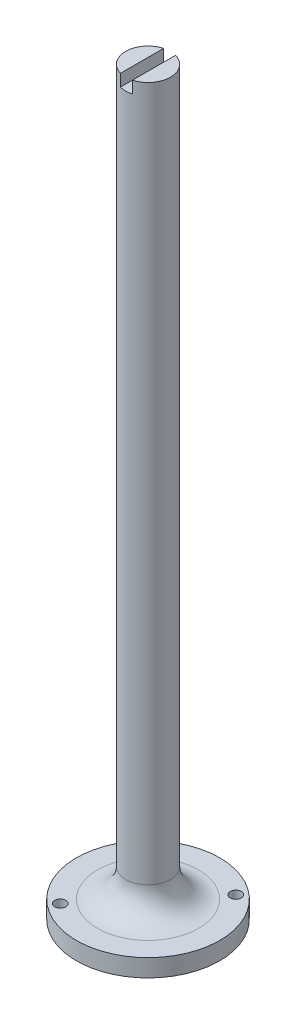
ISO-10303-21;
HEADER;
FILE_DESCRIPTION(('STEP AP214'),'2;1');
FILE_NAME('part.step','',(''),(''),'','','');
FILE_SCHEMA(('AUTOMOTIVE_DESIGN { 1 0 10303 214 1 1 1 1 }'));
ENDSEC;
DATA;
#1=APPLICATION_CONTEXT('core data for automotive mechanical design processes');
#2=APPLICATION_PROTOCOL_DEFINITION('international standard','automotive_design',2000,#1);
#3=PRODUCT_CONTEXT('',#1,'mechanical');
#4=PRODUCT('Part','Part','',(#3));
#5=PRODUCT_RELATED_PRODUCT_CATEGORY('part','',(#4));
#6=PRODUCT_DEFINITION_FORMATION('','',#4);
#7=PRODUCT_DEFINITION_CONTEXT('part definition',#1,'design');
#8=PRODUCT_DEFINITION('design','',#6,#7);
#9=PRODUCT_DEFINITION_SHAPE('','',#8);
#10=(LENGTH_UNIT() NAMED_UNIT(*) SI_UNIT(.MILLI.,.METRE.));
#11=(NAMED_UNIT(*) PLANE_ANGLE_UNIT() SI_UNIT($,.RADIAN.));
#12=(NAMED_UNIT(*) SI_UNIT($,.STERADIAN.) SOLID_ANGLE_UNIT());
#13=UNCERTAINTY_MEASURE_WITH_UNIT(LENGTH_MEASURE(1.E-05),#10,'distance_accuracy_value','');
#14=(GEOMETRIC_REPRESENTATION_CONTEXT(3) GLOBAL_UNCERTAINTY_ASSIGNED_CONTEXT((#13)) GLOBAL_UNIT_ASSIGNED_CONTEXT((#10,
#11,#12)) REPRESENTATION_CONTEXT('',''));
#15=CARTESIAN_POINT('',(0.,0.,0.));
#16=DIRECTION('',(0.,0.,1.));
#17=DIRECTION('',(1.,0.,0.));
#18=AXIS2_PLACEMENT_3D('',#15,#16,#17);
#19=CARTESIAN_POINT('',(3.175,105.,0.));
#20=DIRECTION('',(0.,1.,0.));
#21=DIRECTION('',(0.,0.,1.));
#22=AXIS2_PLACEMENT_3D('',#19,#20,#21);
#23=PLANE('',#22);
#24=DIRECTION('',(0.,0.,1.));
#25=VECTOR('',#24,1.);
#26=CARTESIAN_POINT('',(-0.850000000000013,105.,0.));
#27=LINE('',#26,#25);
#28=CARTESIAN_POINT('',(-0.850000000000013,105.,-3.05910526134685));
#29=VERTEX_POINT('',#28);
#30=CARTESIAN_POINT('',(-0.850000000000013,105.,3.05910526134685));
#31=VERTEX_POINT('',#30);
#32=EDGE_CURVE('E63',#29,#31,#27,.T.);
#33=ORIENTED_EDGE('',*,*,#32,.F.);
#34=CARTESIAN_POINT('',(0.,105.,0.));
#35=DIRECTION('',(0.,-1.,0.));
#36=DIRECTION('',(0.,0.,-1.));
#37=AXIS2_PLACEMENT_3D('',#34,#35,#36);
#38=CIRCLE('',#37,3.175);
#39=EDGE_CURVE('E98',#31,#29,#38,.T.);
#40=ORIENTED_EDGE('',*,*,#39,.F.);
#41=EDGE_LOOP('',(#33,#40));
#42=FACE_BOUND('',#41,.T.);
#43=ADVANCED_FACE('F39',(#42),#23,.T.);
#44=CARTESIAN_POINT('',(0.,0.,0.));
#45=DIRECTION('',(0.,-1.,0.));
#46=DIRECTION('',(0.,0.,-1.));
#47=AXIS2_PLACEMENT_3D('',#44,#45,#46);
#48=PLANE('',#47);
#49=CARTESIAN_POINT('',(-5.67503926456091,0.,6.76482293528091));
#50=DIRECTION('',(0.,-1.,0.));
#51=DIRECTION('',(0.,0.,-1.));
#52=AXIS2_PLACEMENT_3D('',#49,#50,#51);
#53=CIRCLE('',#52,0.793749999999989);
#54=CARTESIAN_POINT('',(-5.67503926456091,0.,5.97107293528092));
#55=VERTEX_POINT('',#54);
#56=EDGE_CURVE('E134',#55,#55,#53,.T.);
#57=ORIENTED_EDGE('',*,*,#56,.F.);
#58=EDGE_LOOP('',(#57));
#59=FACE_BOUND('',#58,.T.);
#60=CARTESIAN_POINT('',(5.6750392645609,0.,-6.76482293527934));
#61=DIRECTION('',(0.,-1.,0.));
#62=DIRECTION('',(0.,0.,-1.));
#63=AXIS2_PLACEMENT_3D('',#60,#61,#62);
#64=CIRCLE('',#63,0.793749999999989);
#65=CARTESIAN_POINT('',(5.6750392645609,0.,-7.55857293527932));
#66=VERTEX_POINT('',#65);
#67=EDGE_CURVE('E131',#66,#66,#64,.T.);
#68=ORIENTED_EDGE('',*,*,#67,.F.);
#69=EDGE_LOOP('',(#68));
#70=FACE_BOUND('',#69,.T.);
#71=CARTESIAN_POINT('',(0.,0.,0.));
#72=DIRECTION('',(0.,-1.,0.));
#73=DIRECTION('',(0.,0.,-1.));
#74=AXIS2_PLACEMENT_3D('',#71,#72,#73);
#75=CIRCLE('',#74,10.16);
#76=CARTESIAN_POINT('',(0.,0.,-10.16));
#77=VERTEX_POINT('',#76);
#78=EDGE_CURVE('E101',#77,#77,#75,.T.);
#79=ORIENTED_EDGE('',*,*,#78,.T.);
#80=EDGE_LOOP('',(#79));
#81=FACE_BOUND('',#80,.T.);
#82=ADVANCED_FACE('F156',(#59,#70,#81),#48,.T.);
#83=CARTESIAN_POINT('',(0.,-31.8317037555853,0.));
#84=DIRECTION('',(0.,-1.,0.));
#85=DIRECTION('',(0.,0.,-1.));
#86=AXIS2_PLACEMENT_3D('',#83,#84,#85);
#87=CYLINDRICAL_SURFACE('',#86,10.16);
#88=CARTESIAN_POINT('',(0.,2.5,0.));
#89=DIRECTION('',(0.,-1.,0.));
#90=DIRECTION('',(0.,0.,-1.));
#91=AXIS2_PLACEMENT_3D('',#88,#89,#90);
#92=CIRCLE('',#91,10.16);
#93=CARTESIAN_POINT('',(0.,2.5,-10.16));
#94=VERTEX_POINT('',#93);
#95=EDGE_CURVE('E97',#94,#94,#92,.T.);
#96=ORIENTED_EDGE('',*,*,#95,.T.);
#97=EDGE_LOOP('',(#96));
#98=FACE_BOUND('',#97,.T.);
#99=ORIENTED_EDGE('',*,*,#78,.F.);
#100=EDGE_LOOP('',(#99));
#101=FACE_BOUND('',#100,.T.);
#102=ADVANCED_FACE('F146',(#98,#101),#87,.T.);
#103=CARTESIAN_POINT('',(10.16,2.5,0.));
#104=DIRECTION('',(0.,1.,0.));
#105=DIRECTION('',(0.,0.,1.));
#106=AXIS2_PLACEMENT_3D('',#103,#104,#105);
#107=PLANE('',#106);
#108=CARTESIAN_POINT('',(-5.67503926456091,2.5,6.76482293528091));
#109=DIRECTION('',(0.,1.,0.));
#110=DIRECTION('',(0.,0.,1.));
#111=AXIS2_PLACEMENT_3D('',#108,#109,#110);
#112=CIRCLE('',#111,0.793749999999988);
#113=CARTESIAN_POINT('',(-5.67503926456091,2.5,7.5585729352809));
#114=VERTEX_POINT('',#113);
#115=EDGE_CURVE('E43',#114,#114,#112,.T.);
#116=ORIENTED_EDGE('',*,*,#115,.F.);
#117=EDGE_LOOP('',(#116));
#118=FACE_BOUND('',#117,.T.);
#119=CARTESIAN_POINT('',(5.6750392645609,2.5,-6.76482293527934));
#120=DIRECTION('',(0.,1.,0.));
#121=DIRECTION('',(0.,0.,1.));
#122=AXIS2_PLACEMENT_3D('',#119,#120,#121);
#123=CIRCLE('',#122,0.793749999999988);
#124=CARTESIAN_POINT('',(5.6750392645609,2.5,-5.97107293527935));
#125=VERTEX_POINT('',#124);
#126=EDGE_CURVE('E123',#125,#125,#123,.T.);
#127=ORIENTED_EDGE('',*,*,#126,.F.);
#128=EDGE_LOOP('',(#127));
#129=FACE_BOUND('',#128,.T.);
#130=CARTESIAN_POINT('',(0.,2.5,0.));
#131=DIRECTION('',(0.,1.,0.));
#132=DIRECTION('',(0.,0.,1.));
#133=AXIS2_PLACEMENT_3D('',#130,#131,#132);
#134=CIRCLE('',#133,7.175);
#135=CARTESIAN_POINT('',(0.,2.5,7.175));
#136=VERTEX_POINT('',#135);
#137=EDGE_CURVE('E110',#136,#136,#134,.F.);
#138=ORIENTED_EDGE('',*,*,#137,.T.);
#139=EDGE_LOOP('',(#138));
#140=FACE_BOUND('',#139,.T.);
#141=ORIENTED_EDGE('',*,*,#95,.F.);
#142=EDGE_LOOP('',(#141));
#143=FACE_BOUND('',#142,.T.);
#144=ADVANCED_FACE('F143',(#118,#129,#140,#143),#107,.T.);
#145=CARTESIAN_POINT('',(0.,-31.8317037555853,0.));
#146=DIRECTION('',(0.,-1.,0.));
#147=DIRECTION('',(0.,0.,-1.));
#148=AXIS2_PLACEMENT_3D('',#145,#146,#147);
#149=CYLINDRICAL_SURFACE('',#148,3.175);
#150=DIRECTION('',(0.,-1.,0.));
#151=VECTOR('',#150,1.);
#152=CARTESIAN_POINT('',(-0.85000000000003,-31.8317037555853,3.05910526134685));
#153=LINE('',#152,#151);
#154=CARTESIAN_POINT('',(-0.850000000000013,103.3,3.05910526134685));
#155=VERTEX_POINT('',#154);
#156=EDGE_CURVE('E122',#31,#155,#153,.T.);
#157=ORIENTED_EDGE('',*,*,#156,.F.);
#158=ORIENTED_EDGE('',*,*,#39,.T.);
#159=DIRECTION('',(0.,-1.,0.));
#160=VECTOR('',#159,1.);
#161=CARTESIAN_POINT('',(-0.85000000000003,-31.8317037555853,-3.05910526134685));
#162=LINE('',#161,#160);
#163=CARTESIAN_POINT('',(-0.850000000000013,103.3,-3.05910526134685));
#164=VERTEX_POINT('',#163);
#165=EDGE_CURVE('E104',#164,#29,#162,.F.);
#166=ORIENTED_EDGE('',*,*,#165,.F.);
#167=CARTESIAN_POINT('',(0.,103.3,0.));
#168=DIRECTION('',(0.,-1.,0.));
#169=DIRECTION('',(0.,0.,-1.));
#170=AXIS2_PLACEMENT_3D('',#167,#168,#169);
#171=CIRCLE('',#170,3.175);
#172=CARTESIAN_POINT('',(0.849999999999987,103.3,-3.05910526134686));
#173=VERTEX_POINT('',#172);
#174=EDGE_CURVE('E48',#173,#164,#171,.F.);
#175=ORIENTED_EDGE('',*,*,#174,.F.);
#176=DIRECTION('',(0.,-1.,0.));
#177=VECTOR('',#176,1.);
#178=CARTESIAN_POINT('',(0.849999999997988,-31.8317037555853,-3.05910526134741));
#179=LINE('',#178,#177);
#180=CARTESIAN_POINT('',(0.850000000000012,105.,-3.05910526134685));
#181=VERTEX_POINT('',#180);
#182=EDGE_CURVE('E81',#181,#173,#179,.T.);
#183=ORIENTED_EDGE('',*,*,#182,.F.);
#184=CARTESIAN_POINT('',(0.850000000000012,105.,3.05910526134685));
#185=VERTEX_POINT('',#184);
#186=EDGE_CURVE('E92',#181,#185,#38,.T.);
#187=ORIENTED_EDGE('',*,*,#186,.T.);
#188=DIRECTION('',(0.,-1.,0.));
#189=VECTOR('',#188,1.);
#190=CARTESIAN_POINT('',(0.849999999997988,-31.8317037555853,3.05910526134741));
#191=LINE('',#190,#189);
#192=CARTESIAN_POINT('',(0.849999999999987,103.3,3.05910526134686));
#193=VERTEX_POINT('',#192);
#194=EDGE_CURVE('E55',#193,#185,#191,.F.);
#195=ORIENTED_EDGE('',*,*,#194,.F.);
#196=EDGE_CURVE('E11',#155,#193,#171,.F.);
#197=ORIENTED_EDGE('',*,*,#196,.F.);
#198=EDGE_LOOP('',(#157,#158,#166,#175,#183,#187,#195,#197));
#199=FACE_BOUND('',#198,.T.);
#200=CARTESIAN_POINT('',(0.,6.5,0.));
#201=DIRECTION('',(0.,1.,0.));
#202=DIRECTION('',(0.,0.,1.));
#203=AXIS2_PLACEMENT_3D('',#200,#201,#202);
#204=CIRCLE('',#203,3.175);
#205=CARTESIAN_POINT('',(0.,6.5,3.175));
#206=VERTEX_POINT('',#205);
#207=EDGE_CURVE('E86',#206,#206,#204,.T.);
#208=ORIENTED_EDGE('',*,*,#207,.T.);
#209=EDGE_LOOP('',(#208));
#210=FACE_BOUND('',#209,.T.);
#211=ADVANCED_FACE('F90',(#199,#210),#149,.T.);
#212=DIRECTION('',(0.,0.,-1.));
#213=VECTOR('',#212,1.);
#214=CARTESIAN_POINT('',(0.850000000000012,105.,0.));
#215=LINE('',#214,#213);
#216=EDGE_CURVE('E78',#185,#181,#215,.T.);
#217=ORIENTED_EDGE('',*,*,#216,.F.);
#218=ORIENTED_EDGE('',*,*,#186,.F.);
#219=EDGE_LOOP('',(#217,#218));
#220=FACE_BOUND('',#219,.T.);
#221=ADVANCED_FACE('F96',(#220),#23,.T.);
#222=CARTESIAN_POINT('',(0.,6.5,0.));
#223=DIRECTION('',(0.,1.,0.));
#224=DIRECTION('',(0.,0.,1.));
#225=AXIS2_PLACEMENT_3D('',#222,#223,#224);
#226=TOROIDAL_SURFACE('',#225,7.175,4.);
#227=ORIENTED_EDGE('',*,*,#207,.F.);
#228=EDGE_LOOP('',(#227));
#229=FACE_BOUND('',#228,.T.);
#230=ORIENTED_EDGE('',*,*,#137,.F.);
#231=EDGE_LOOP('',(#230));
#232=FACE_BOUND('',#231,.T.);
#233=ADVANCED_FACE('F41',(#229,#232),#226,.F.);
#234=CARTESIAN_POINT('',(-0.850000000000013,105.,-10.16));
#235=DIRECTION('',(-1.,0.,0.));
#236=DIRECTION('',(0.,-1.,0.));
#237=AXIS2_PLACEMENT_3D('',#234,#235,#236);
#238=PLANE('',#237);
#239=ORIENTED_EDGE('',*,*,#165,.T.);
#240=ORIENTED_EDGE('',*,*,#32,.T.);
#241=ORIENTED_EDGE('',*,*,#156,.T.);
#242=DIRECTION('',(0.,0.,1.));
#243=VECTOR('',#242,1.);
#244=CARTESIAN_POINT('',(-0.850000000000013,103.3,-10.16));
#245=LINE('',#244,#243);
#246=EDGE_CURVE('E119',#164,#155,#245,.T.);
#247=ORIENTED_EDGE('',*,*,#246,.F.);
#248=EDGE_LOOP('',(#239,#240,#241,#247));
#249=FACE_BOUND('',#248,.T.);
#250=ADVANCED_FACE('F121',(#249),#238,.F.);
#251=CARTESIAN_POINT('',(0.850000000000012,105.,-10.16));
#252=DIRECTION('',(1.,0.,0.));
#253=DIRECTION('',(0.,1.,0.));
#254=AXIS2_PLACEMENT_3D('',#251,#252,#253);
#255=PLANE('',#254);
#256=ORIENTED_EDGE('',*,*,#194,.T.);
#257=ORIENTED_EDGE('',*,*,#216,.T.);
#258=ORIENTED_EDGE('',*,*,#182,.T.);
#259=DIRECTION('',(0.,0.,1.));
#260=VECTOR('',#259,1.);
#261=CARTESIAN_POINT('',(0.849999999999987,103.3,-10.16));
#262=LINE('',#261,#260);
#263=EDGE_CURVE('E94',#173,#193,#262,.T.);
#264=ORIENTED_EDGE('',*,*,#263,.T.);
#265=EDGE_LOOP('',(#256,#257,#258,#264));
#266=FACE_BOUND('',#265,.T.);
#267=ADVANCED_FACE('F80',(#266),#255,.F.);
#268=CARTESIAN_POINT('',(-0.850000000000013,103.3,-10.16));
#269=DIRECTION('',(0.,-1.,0.));
#270=DIRECTION('',(0.,0.,-1.));
#271=AXIS2_PLACEMENT_3D('',#268,#269,#270);
#272=PLANE('',#271);
#273=ORIENTED_EDGE('',*,*,#196,.T.);
#274=ORIENTED_EDGE('',*,*,#263,.F.);
#275=ORIENTED_EDGE('',*,*,#174,.T.);
#276=ORIENTED_EDGE('',*,*,#246,.T.);
#277=EDGE_LOOP('',(#273,#274,#275,#276));
#278=FACE_BOUND('',#277,.T.);
#279=ADVANCED_FACE('F118',(#278),#272,.F.);
#280=CARTESIAN_POINT('',(5.6750392645609,0.,-6.76482293527934));
#281=DIRECTION('',(0.,-1.,0.));
#282=DIRECTION('',(0.,0.,-1.));
#283=AXIS2_PLACEMENT_3D('',#280,#281,#282);
#284=CYLINDRICAL_SURFACE('',#283,0.793749999999988);
#285=ORIENTED_EDGE('',*,*,#126,.T.);
#286=EDGE_LOOP('',(#285));
#287=FACE_BOUND('',#286,.T.);
#288=ORIENTED_EDGE('',*,*,#67,.T.);
#289=EDGE_LOOP('',(#288));
#290=FACE_BOUND('',#289,.T.);
#291=ADVANCED_FACE('F177',(#287,#290),#284,.F.);
#292=CARTESIAN_POINT('',(-5.67503926456091,0.,6.76482293528091));
#293=DIRECTION('',(0.,-1.,0.));
#294=DIRECTION('',(0.,0.,-1.));
#295=AXIS2_PLACEMENT_3D('',#292,#293,#294);
#296=CYLINDRICAL_SURFACE('',#295,0.793749999999988);
#297=ORIENTED_EDGE('',*,*,#115,.T.);
#298=EDGE_LOOP('',(#297));
#299=FACE_BOUND('',#298,.T.);
#300=ORIENTED_EDGE('',*,*,#56,.T.);
#301=EDGE_LOOP('',(#300));
#302=FACE_BOUND('',#301,.T.);
#303=ADVANCED_FACE('F141',(#299,#302),#296,.F.);
#304=CLOSED_SHELL('',(#43,#82,#102,#144,#211,#221,#233,#250,#267,#279,#291,#303));
#305=MANIFOLD_SOLID_BREP('B2',#304);
#306=ADVANCED_BREP_SHAPE_REPRESENTATION('',(#18,#305),#14);
#307=SHAPE_DEFINITION_REPRESENTATION(#9,#306);
ENDSEC;
END-ISO-10303-21;
